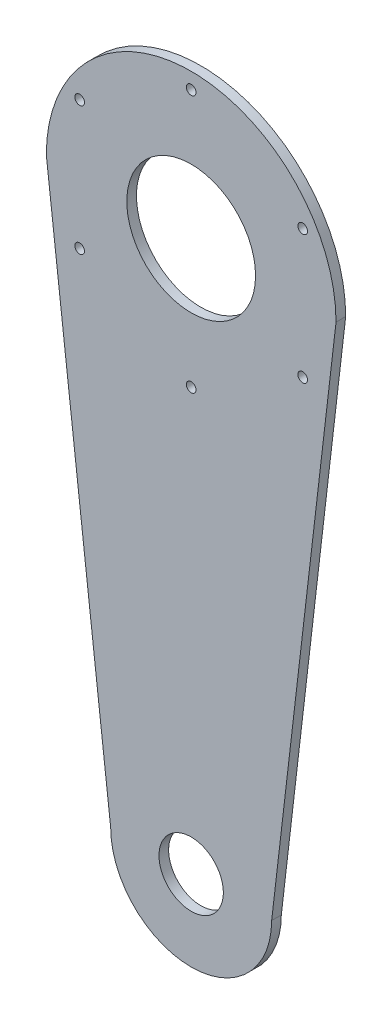
ISO-10303-21;
HEADER;
FILE_DESCRIPTION(('STEP AP214'),'2;1');
FILE_NAME('part.step','',(''),(''),'','','');
FILE_SCHEMA(('AUTOMOTIVE_DESIGN { 1 0 10303 214 1 1 1 1 }'));
ENDSEC;
DATA;
#1=APPLICATION_CONTEXT('core data for automotive mechanical design processes');
#2=APPLICATION_PROTOCOL_DEFINITION('international standard','automotive_design',2000,#1);
#3=PRODUCT_CONTEXT('',#1,'mechanical');
#4=PRODUCT('Part','Part','',(#3));
#5=PRODUCT_RELATED_PRODUCT_CATEGORY('part','',(#4));
#6=PRODUCT_DEFINITION_FORMATION('','',#4);
#7=PRODUCT_DEFINITION_CONTEXT('part definition',#1,'design');
#8=PRODUCT_DEFINITION('design','',#6,#7);
#9=PRODUCT_DEFINITION_SHAPE('','',#8);
#10=(LENGTH_UNIT() NAMED_UNIT(*) SI_UNIT(.MILLI.,.METRE.));
#11=(NAMED_UNIT(*) PLANE_ANGLE_UNIT() SI_UNIT($,.RADIAN.));
#12=(NAMED_UNIT(*) SI_UNIT($,.STERADIAN.) SOLID_ANGLE_UNIT());
#13=UNCERTAINTY_MEASURE_WITH_UNIT(LENGTH_MEASURE(1.E-05),#10,'distance_accuracy_value','');
#14=(GEOMETRIC_REPRESENTATION_CONTEXT(3) GLOBAL_UNCERTAINTY_ASSIGNED_CONTEXT((#13)) GLOBAL_UNIT_ASSIGNED_CONTEXT((#10,
#11,#12)) REPRESENTATION_CONTEXT('',''));
#15=CARTESIAN_POINT('',(0.,0.,0.));
#16=DIRECTION('',(0.,0.,1.));
#17=DIRECTION('',(1.,0.,0.));
#18=AXIS2_PLACEMENT_3D('',#15,#16,#17);
#19=CARTESIAN_POINT('',(-44.3927330386964,-5.19213251914581,3.));
#20=DIRECTION('',(0.993229670639021,0.116167212940237,0.));
#21=DIRECTION('',(-0.116167212940237,0.993229670639021,0.));
#22=AXIS2_PLACEMENT_3D('',#19,#20,#21);
#23=PLANE('',#22);
#24=DIRECTION('',(0.116167212940237,-0.993229670639021,0.));
#25=VECTOR('',#24,1.);
#26=CARTESIAN_POINT('',(-44.3927330386964,-5.19213251914581,0.));
#27=LINE('',#26,#25);
#28=CARTESIAN_POINT('',(-45.,0.,0.));
#29=VERTEX_POINT('',#28);
#30=CARTESIAN_POINT('',(-24.9999999999999,-171.,0.));
#31=VERTEX_POINT('',#30);
#32=EDGE_CURVE('E147',#29,#31,#27,.T.);
#33=ORIENTED_EDGE('',*,*,#32,.T.);
#34=DIRECTION('',(0.,0.,-1.));
#35=VECTOR('',#34,1.);
#36=CARTESIAN_POINT('',(-24.9999999999999,-171.,3.));
#37=LINE('',#36,#35);
#38=CARTESIAN_POINT('',(-24.9999999999999,-171.,3.));
#39=VERTEX_POINT('',#38);
#40=EDGE_CURVE('E11',#39,#31,#37,.T.);
#41=ORIENTED_EDGE('',*,*,#40,.F.);
#42=DIRECTION('',(0.116167212940237,-0.993229670639021,0.));
#43=VECTOR('',#42,1.);
#44=CARTESIAN_POINT('',(-44.3927330386964,-5.19213251914581,3.));
#45=LINE('',#44,#43);
#46=CARTESIAN_POINT('',(-45.,0.,3.));
#47=VERTEX_POINT('',#46);
#48=EDGE_CURVE('E96',#47,#39,#45,.T.);
#49=ORIENTED_EDGE('',*,*,#48,.F.);
#50=DIRECTION('',(0.,0.,-1.));
#51=VECTOR('',#50,1.);
#52=CARTESIAN_POINT('',(-45.,0.,3.));
#53=LINE('',#52,#51);
#54=EDGE_CURVE('E111',#47,#29,#53,.T.);
#55=ORIENTED_EDGE('',*,*,#54,.T.);
#56=EDGE_LOOP('',(#33,#41,#49,#55));
#57=FACE_BOUND('',#56,.T.);
#58=ADVANCED_FACE('F47',(#57),#23,.F.);
#59=CARTESIAN_POINT('',(1.12177646801898E-13,-171.,3.));
#60=DIRECTION('',(0.,0.,-1.));
#61=DIRECTION('',(-1.,0.,0.));
#62=AXIS2_PLACEMENT_3D('',#59,#60,#61);
#63=CYLINDRICAL_SURFACE('',#62,25.);
#64=CARTESIAN_POINT('',(1.12177646801898E-13,-171.,0.));
#65=DIRECTION('',(0.,0.,1.));
#66=DIRECTION('',(1.,0.,0.));
#67=AXIS2_PLACEMENT_3D('',#64,#65,#66);
#68=CIRCLE('',#67,25.);
#69=CARTESIAN_POINT('',(25.0000000000001,-171.,0.));
#70=VERTEX_POINT('',#69);
#71=EDGE_CURVE('E102',#31,#70,#68,.T.);
#72=ORIENTED_EDGE('',*,*,#71,.T.);
#73=DIRECTION('',(0.,0.,-1.));
#74=VECTOR('',#73,1.);
#75=CARTESIAN_POINT('',(25.0000000000001,-171.,3.));
#76=LINE('',#75,#74);
#77=CARTESIAN_POINT('',(25.0000000000001,-171.,3.));
#78=VERTEX_POINT('',#77);
#79=EDGE_CURVE('E57',#78,#70,#76,.T.);
#80=ORIENTED_EDGE('',*,*,#79,.F.);
#81=CARTESIAN_POINT('',(1.12177646801898E-13,-171.,3.));
#82=DIRECTION('',(0.,0.,1.));
#83=DIRECTION('',(1.,0.,0.));
#84=AXIS2_PLACEMENT_3D('',#81,#82,#83);
#85=CIRCLE('',#84,25.);
#86=EDGE_CURVE('E91',#39,#78,#85,.T.);
#87=ORIENTED_EDGE('',*,*,#86,.F.);
#88=ORIENTED_EDGE('',*,*,#40,.T.);
#89=EDGE_LOOP('',(#72,#80,#87,#88));
#90=FACE_BOUND('',#89,.T.);
#91=ADVANCED_FACE('F101',(#90),#63,.T.);
#92=CARTESIAN_POINT('',(44.3927330386964,-5.19213251914575,3.));
#93=DIRECTION('',(0.993229670639021,-0.116167212940236,0.));
#94=DIRECTION('',(0.116167212940236,0.993229670639021,0.));
#95=AXIS2_PLACEMENT_3D('',#92,#93,#94);
#96=PLANE('',#95);
#97=DIRECTION('',(-0.116167212940236,-0.993229670639021,0.));
#98=VECTOR('',#97,1.);
#99=CARTESIAN_POINT('',(44.3927330386964,-5.19213251914575,0.));
#100=LINE('',#99,#98);
#101=CARTESIAN_POINT('',(45.,0.,0.));
#102=VERTEX_POINT('',#101);
#103=EDGE_CURVE('E153',#102,#70,#100,.T.);
#104=ORIENTED_EDGE('',*,*,#103,.F.);
#105=DIRECTION('',(0.,0.,-1.));
#106=VECTOR('',#105,1.);
#107=CARTESIAN_POINT('',(45.,0.,3.));
#108=LINE('',#107,#106);
#109=CARTESIAN_POINT('',(45.,0.,3.));
#110=VERTEX_POINT('',#109);
#111=EDGE_CURVE('E81',#110,#102,#108,.T.);
#112=ORIENTED_EDGE('',*,*,#111,.F.);
#113=DIRECTION('',(-0.116167212940236,-0.993229670639021,0.));
#114=VECTOR('',#113,1.);
#115=CARTESIAN_POINT('',(44.3927330386964,-5.19213251914575,3.));
#116=LINE('',#115,#114);
#117=EDGE_CURVE('E94',#110,#78,#116,.T.);
#118=ORIENTED_EDGE('',*,*,#117,.T.);
#119=ORIENTED_EDGE('',*,*,#79,.T.);
#120=EDGE_LOOP('',(#104,#112,#118,#119));
#121=FACE_BOUND('',#120,.T.);
#122=ADVANCED_FACE('F107',(#121),#96,.T.);
#123=CARTESIAN_POINT('',(1.12177646801898E-13,-171.,3.));
#124=DIRECTION('',(0.,0.,-1.));
#125=DIRECTION('',(-1.,0.,0.));
#126=AXIS2_PLACEMENT_3D('',#123,#124,#125);
#127=CYLINDRICAL_SURFACE('',#126,10.);
#128=CARTESIAN_POINT('',(1.12177646801898E-13,-171.,3.));
#129=DIRECTION('',(0.,0.,1.));
#130=DIRECTION('',(1.,0.,0.));
#131=AXIS2_PLACEMENT_3D('',#128,#129,#130);
#132=CIRCLE('',#131,10.);
#133=CARTESIAN_POINT('',(10.0000000000001,-171.,3.));
#134=VERTEX_POINT('',#133);
#135=EDGE_CURVE('E265',#134,#134,#132,.T.);
#136=ORIENTED_EDGE('',*,*,#135,.T.);
#137=EDGE_LOOP('',(#136));
#138=FACE_BOUND('',#137,.T.);
#139=CARTESIAN_POINT('',(1.12177646801898E-13,-171.,0.));
#140=DIRECTION('',(0.,0.,1.));
#141=DIRECTION('',(1.,0.,0.));
#142=AXIS2_PLACEMENT_3D('',#139,#140,#141);
#143=CIRCLE('',#142,10.);
#144=CARTESIAN_POINT('',(10.0000000000001,-171.,0.));
#145=VERTEX_POINT('',#144);
#146=EDGE_CURVE('E143',#145,#145,#143,.T.);
#147=ORIENTED_EDGE('',*,*,#146,.F.);
#148=EDGE_LOOP('',(#147));
#149=FACE_BOUND('',#148,.T.);
#150=ADVANCED_FACE('F185',(#138,#149),#127,.F.);
#151=CARTESIAN_POINT('',(0.,0.,3.));
#152=DIRECTION('',(0.,0.,-1.));
#153=DIRECTION('',(-1.,0.,0.));
#154=AXIS2_PLACEMENT_3D('',#151,#152,#153);
#155=CYLINDRICAL_SURFACE('',#154,20.);
#156=CARTESIAN_POINT('',(0.,0.,3.));
#157=DIRECTION('',(0.,0.,1.));
#158=DIRECTION('',(1.,0.,0.));
#159=AXIS2_PLACEMENT_3D('',#156,#157,#158);
#160=CIRCLE('',#159,20.);
#161=CARTESIAN_POINT('',(20.,0.,3.));
#162=VERTEX_POINT('',#161);
#163=EDGE_CURVE('E261',#162,#162,#160,.T.);
#164=ORIENTED_EDGE('',*,*,#163,.T.);
#165=EDGE_LOOP('',(#164));
#166=FACE_BOUND('',#165,.T.);
#167=CARTESIAN_POINT('',(0.,0.,0.));
#168=DIRECTION('',(0.,0.,1.));
#169=DIRECTION('',(1.,0.,0.));
#170=AXIS2_PLACEMENT_3D('',#167,#168,#169);
#171=CIRCLE('',#170,20.);
#172=CARTESIAN_POINT('',(20.,0.,0.));
#173=VERTEX_POINT('',#172);
#174=EDGE_CURVE('E139',#173,#173,#171,.T.);
#175=ORIENTED_EDGE('',*,*,#174,.F.);
#176=EDGE_LOOP('',(#175));
#177=FACE_BOUND('',#176,.T.);
#178=ADVANCED_FACE('F188',(#166,#177),#155,.F.);
#179=CARTESIAN_POINT('',(0.,40.,3.));
#180=DIRECTION('',(0.,0.,-1.));
#181=DIRECTION('',(-1.,0.,0.));
#182=AXIS2_PLACEMENT_3D('',#179,#180,#181);
#183=CYLINDRICAL_SURFACE('',#182,1.5);
#184=CARTESIAN_POINT('',(0.,40.,3.));
#185=DIRECTION('',(0.,0.,1.));
#186=DIRECTION('',(1.,0.,0.));
#187=AXIS2_PLACEMENT_3D('',#184,#185,#186);
#188=CIRCLE('',#187,1.5);
#189=CARTESIAN_POINT('',(1.5,40.,3.));
#190=VERTEX_POINT('',#189);
#191=EDGE_CURVE('E257',#190,#190,#188,.T.);
#192=ORIENTED_EDGE('',*,*,#191,.T.);
#193=EDGE_LOOP('',(#192));
#194=FACE_BOUND('',#193,.T.);
#195=CARTESIAN_POINT('',(0.,40.,0.));
#196=DIRECTION('',(0.,0.,1.));
#197=DIRECTION('',(1.,0.,0.));
#198=AXIS2_PLACEMENT_3D('',#195,#196,#197);
#199=CIRCLE('',#198,1.5);
#200=CARTESIAN_POINT('',(1.5,40.,0.));
#201=VERTEX_POINT('',#200);
#202=EDGE_CURVE('E135',#201,#201,#199,.T.);
#203=ORIENTED_EDGE('',*,*,#202,.F.);
#204=EDGE_LOOP('',(#203));
#205=FACE_BOUND('',#204,.T.);
#206=ADVANCED_FACE('F192',(#194,#205),#183,.F.);
#207=CARTESIAN_POINT('',(34.6410161513776,19.9999999999999,3.));
#208=DIRECTION('',(0.,0.,-1.));
#209=DIRECTION('',(-1.,0.,0.));
#210=AXIS2_PLACEMENT_3D('',#207,#208,#209);
#211=CYLINDRICAL_SURFACE('',#210,1.5);
#212=CARTESIAN_POINT('',(34.6410161513776,19.9999999999999,3.));
#213=DIRECTION('',(0.,0.,1.));
#214=DIRECTION('',(1.,0.,0.));
#215=AXIS2_PLACEMENT_3D('',#212,#213,#214);
#216=CIRCLE('',#215,1.5);
#217=CARTESIAN_POINT('',(36.1410161513776,19.9999999999999,3.));
#218=VERTEX_POINT('',#217);
#219=EDGE_CURVE('E253',#218,#218,#216,.T.);
#220=ORIENTED_EDGE('',*,*,#219,.T.);
#221=EDGE_LOOP('',(#220));
#222=FACE_BOUND('',#221,.T.);
#223=CARTESIAN_POINT('',(34.6410161513776,19.9999999999999,0.));
#224=DIRECTION('',(0.,0.,1.));
#225=DIRECTION('',(1.,0.,0.));
#226=AXIS2_PLACEMENT_3D('',#223,#224,#225);
#227=CIRCLE('',#226,1.5);
#228=CARTESIAN_POINT('',(36.1410161513776,19.9999999999999,0.));
#229=VERTEX_POINT('',#228);
#230=EDGE_CURVE('E131',#229,#229,#227,.T.);
#231=ORIENTED_EDGE('',*,*,#230,.F.);
#232=EDGE_LOOP('',(#231));
#233=FACE_BOUND('',#232,.T.);
#234=ADVANCED_FACE('F196',(#222,#233),#211,.F.);
#235=CARTESIAN_POINT('',(34.6410161513775,-20.0000000000002,3.));
#236=DIRECTION('',(0.,0.,-1.));
#237=DIRECTION('',(-1.,0.,0.));
#238=AXIS2_PLACEMENT_3D('',#235,#236,#237);
#239=CYLINDRICAL_SURFACE('',#238,1.5);
#240=CARTESIAN_POINT('',(34.6410161513775,-20.0000000000002,3.));
#241=DIRECTION('',(0.,0.,1.));
#242=DIRECTION('',(1.,0.,0.));
#243=AXIS2_PLACEMENT_3D('',#240,#241,#242);
#244=CIRCLE('',#243,1.5);
#245=CARTESIAN_POINT('',(36.1410161513775,-20.0000000000002,3.));
#246=VERTEX_POINT('',#245);
#247=EDGE_CURVE('E245',#246,#246,#244,.T.);
#248=ORIENTED_EDGE('',*,*,#247,.T.);
#249=EDGE_LOOP('',(#248));
#250=FACE_BOUND('',#249,.T.);
#251=CARTESIAN_POINT('',(34.6410161513775,-20.0000000000002,0.));
#252=DIRECTION('',(0.,0.,1.));
#253=DIRECTION('',(1.,0.,0.));
#254=AXIS2_PLACEMENT_3D('',#251,#252,#253);
#255=CIRCLE('',#254,1.5);
#256=CARTESIAN_POINT('',(36.1410161513775,-20.0000000000002,0.));
#257=VERTEX_POINT('',#256);
#258=EDGE_CURVE('E127',#257,#257,#255,.T.);
#259=ORIENTED_EDGE('',*,*,#258,.F.);
#260=EDGE_LOOP('',(#259));
#261=FACE_BOUND('',#260,.T.);
#262=ADVANCED_FACE('F200',(#250,#261),#239,.F.);
#263=CARTESIAN_POINT('',(-2.79318507107451E-13,-40.,3.));
#264=DIRECTION('',(0.,0.,-1.));
#265=DIRECTION('',(-1.,0.,0.));
#266=AXIS2_PLACEMENT_3D('',#263,#264,#265);
#267=CYLINDRICAL_SURFACE('',#266,1.5);
#268=CARTESIAN_POINT('',(-2.79318507107451E-13,-40.,3.));
#269=DIRECTION('',(0.,0.,1.));
#270=DIRECTION('',(1.,0.,0.));
#271=AXIS2_PLACEMENT_3D('',#268,#269,#270);
#272=CIRCLE('',#271,1.5);
#273=CARTESIAN_POINT('',(1.49999999999972,-40.,3.));
#274=VERTEX_POINT('',#273);
#275=EDGE_CURVE('E240',#274,#274,#272,.T.);
#276=ORIENTED_EDGE('',*,*,#275,.T.);
#277=EDGE_LOOP('',(#276));
#278=FACE_BOUND('',#277,.T.);
#279=CARTESIAN_POINT('',(-2.79318507107451E-13,-40.,0.));
#280=DIRECTION('',(0.,0.,1.));
#281=DIRECTION('',(1.,0.,0.));
#282=AXIS2_PLACEMENT_3D('',#279,#280,#281);
#283=CIRCLE('',#282,1.5);
#284=CARTESIAN_POINT('',(1.49999999999972,-40.,0.));
#285=VERTEX_POINT('',#284);
#286=EDGE_CURVE('E123',#285,#285,#283,.T.);
#287=ORIENTED_EDGE('',*,*,#286,.F.);
#288=EDGE_LOOP('',(#287));
#289=FACE_BOUND('',#288,.T.);
#290=ADVANCED_FACE('F204',(#278,#289),#267,.F.);
#291=CARTESIAN_POINT('',(-34.6410161513777,-19.9999999999997,3.));
#292=DIRECTION('',(0.,0.,-1.));
#293=DIRECTION('',(-1.,0.,0.));
#294=AXIS2_PLACEMENT_3D('',#291,#292,#293);
#295=CYLINDRICAL_SURFACE('',#294,1.5);
#296=CARTESIAN_POINT('',(-34.6410161513777,-19.9999999999997,3.));
#297=DIRECTION('',(0.,0.,1.));
#298=DIRECTION('',(1.,0.,0.));
#299=AXIS2_PLACEMENT_3D('',#296,#297,#298);
#300=CIRCLE('',#299,1.5);
#301=CARTESIAN_POINT('',(-33.1410161513777,-19.9999999999997,3.));
#302=VERTEX_POINT('',#301);
#303=EDGE_CURVE('E218',#302,#302,#300,.T.);
#304=ORIENTED_EDGE('',*,*,#303,.T.);
#305=EDGE_LOOP('',(#304));
#306=FACE_BOUND('',#305,.T.);
#307=CARTESIAN_POINT('',(-34.6410161513777,-19.9999999999997,0.));
#308=DIRECTION('',(0.,0.,1.));
#309=DIRECTION('',(1.,0.,0.));
#310=AXIS2_PLACEMENT_3D('',#307,#308,#309);
#311=CIRCLE('',#310,1.5);
#312=CARTESIAN_POINT('',(-33.1410161513777,-19.9999999999997,0.));
#313=VERTEX_POINT('',#312);
#314=EDGE_CURVE('E119',#313,#313,#311,.T.);
#315=ORIENTED_EDGE('',*,*,#314,.F.);
#316=EDGE_LOOP('',(#315));
#317=FACE_BOUND('',#316,.T.);
#318=ADVANCED_FACE('F207',(#306,#317),#295,.F.);
#319=CARTESIAN_POINT('',(-34.6410161513773,20.0000000000004,3.));
#320=DIRECTION('',(0.,0.,-1.));
#321=DIRECTION('',(-1.,0.,0.));
#322=AXIS2_PLACEMENT_3D('',#319,#320,#321);
#323=CYLINDRICAL_SURFACE('',#322,1.5);
#324=CARTESIAN_POINT('',(-34.6410161513773,20.0000000000004,3.));
#325=DIRECTION('',(0.,0.,1.));
#326=DIRECTION('',(1.,0.,0.));
#327=AXIS2_PLACEMENT_3D('',#324,#325,#326);
#328=CIRCLE('',#327,1.5);
#329=CARTESIAN_POINT('',(-33.1410161513773,20.0000000000004,3.));
#330=VERTEX_POINT('',#329);
#331=EDGE_CURVE('E158',#330,#330,#328,.T.);
#332=ORIENTED_EDGE('',*,*,#331,.T.);
#333=EDGE_LOOP('',(#332));
#334=FACE_BOUND('',#333,.T.);
#335=CARTESIAN_POINT('',(-34.6410161513773,20.0000000000004,0.));
#336=DIRECTION('',(0.,0.,1.));
#337=DIRECTION('',(1.,0.,0.));
#338=AXIS2_PLACEMENT_3D('',#335,#336,#337);
#339=CIRCLE('',#338,1.5);
#340=CARTESIAN_POINT('',(-33.1410161513773,20.0000000000004,0.));
#341=VERTEX_POINT('',#340);
#342=EDGE_CURVE('E115',#341,#341,#339,.T.);
#343=ORIENTED_EDGE('',*,*,#342,.F.);
#344=EDGE_LOOP('',(#343));
#345=FACE_BOUND('',#344,.T.);
#346=ADVANCED_FACE('F49',(#334,#345),#323,.F.);
#347=CARTESIAN_POINT('',(0.,0.,3.));
#348=DIRECTION('',(0.,0.,-1.));
#349=DIRECTION('',(-1.,0.,0.));
#350=AXIS2_PLACEMENT_3D('',#347,#348,#349);
#351=CYLINDRICAL_SURFACE('',#350,45.);
#352=CARTESIAN_POINT('',(0.,0.,0.));
#353=DIRECTION('',(0.,0.,1.));
#354=DIRECTION('',(1.,0.,0.));
#355=AXIS2_PLACEMENT_3D('',#352,#353,#354);
#356=CIRCLE('',#355,45.);
#357=EDGE_CURVE('E84',#102,#29,#356,.T.);
#358=ORIENTED_EDGE('',*,*,#357,.T.);
#359=ORIENTED_EDGE('',*,*,#54,.F.);
#360=CARTESIAN_POINT('',(0.,0.,3.));
#361=DIRECTION('',(0.,0.,1.));
#362=DIRECTION('',(1.,0.,0.));
#363=AXIS2_PLACEMENT_3D('',#360,#361,#362);
#364=CIRCLE('',#363,45.);
#365=EDGE_CURVE('E65',#110,#47,#364,.T.);
#366=ORIENTED_EDGE('',*,*,#365,.F.);
#367=ORIENTED_EDGE('',*,*,#111,.T.);
#368=EDGE_LOOP('',(#358,#359,#366,#367));
#369=FACE_BOUND('',#368,.T.);
#370=ADVANCED_FACE('F172',(#369),#351,.T.);
#371=CARTESIAN_POINT('',(0.,0.,3.));
#372=DIRECTION('',(0.,0.,1.));
#373=DIRECTION('',(1.,0.,0.));
#374=AXIS2_PLACEMENT_3D('',#371,#372,#373);
#375=PLANE('',#374);
#376=ORIENTED_EDGE('',*,*,#331,.F.);
#377=EDGE_LOOP('',(#376));
#378=FACE_BOUND('',#377,.T.);
#379=ORIENTED_EDGE('',*,*,#303,.F.);
#380=EDGE_LOOP('',(#379));
#381=FACE_BOUND('',#380,.T.);
#382=ORIENTED_EDGE('',*,*,#275,.F.);
#383=EDGE_LOOP('',(#382));
#384=FACE_BOUND('',#383,.T.);
#385=ORIENTED_EDGE('',*,*,#247,.F.);
#386=EDGE_LOOP('',(#385));
#387=FACE_BOUND('',#386,.T.);
#388=ORIENTED_EDGE('',*,*,#219,.F.);
#389=EDGE_LOOP('',(#388));
#390=FACE_BOUND('',#389,.T.);
#391=ORIENTED_EDGE('',*,*,#191,.F.);
#392=EDGE_LOOP('',(#391));
#393=FACE_BOUND('',#392,.T.);
#394=ORIENTED_EDGE('',*,*,#163,.F.);
#395=EDGE_LOOP('',(#394));
#396=FACE_BOUND('',#395,.T.);
#397=ORIENTED_EDGE('',*,*,#135,.F.);
#398=EDGE_LOOP('',(#397));
#399=FACE_BOUND('',#398,.T.);
#400=ORIENTED_EDGE('',*,*,#48,.T.);
#401=ORIENTED_EDGE('',*,*,#86,.T.);
#402=ORIENTED_EDGE('',*,*,#117,.F.);
#403=ORIENTED_EDGE('',*,*,#365,.T.);
#404=EDGE_LOOP('',(#400,#401,#402,#403));
#405=FACE_BOUND('',#404,.T.);
#406=ADVANCED_FACE('F92',(#378,#381,#384,#387,#390,#393,#396,#399,#405),#375,.T.);
#407=CARTESIAN_POINT('',(0.,0.,0.));
#408=DIRECTION('',(0.,0.,1.));
#409=DIRECTION('',(1.,0.,0.));
#410=AXIS2_PLACEMENT_3D('',#407,#408,#409);
#411=PLANE('',#410);
#412=ORIENTED_EDGE('',*,*,#342,.T.);
#413=EDGE_LOOP('',(#412));
#414=FACE_BOUND('',#413,.T.);
#415=ORIENTED_EDGE('',*,*,#314,.T.);
#416=EDGE_LOOP('',(#415));
#417=FACE_BOUND('',#416,.T.);
#418=ORIENTED_EDGE('',*,*,#286,.T.);
#419=EDGE_LOOP('',(#418));
#420=FACE_BOUND('',#419,.T.);
#421=ORIENTED_EDGE('',*,*,#258,.T.);
#422=EDGE_LOOP('',(#421));
#423=FACE_BOUND('',#422,.T.);
#424=ORIENTED_EDGE('',*,*,#230,.T.);
#425=EDGE_LOOP('',(#424));
#426=FACE_BOUND('',#425,.T.);
#427=ORIENTED_EDGE('',*,*,#202,.T.);
#428=EDGE_LOOP('',(#427));
#429=FACE_BOUND('',#428,.T.);
#430=ORIENTED_EDGE('',*,*,#174,.T.);
#431=EDGE_LOOP('',(#430));
#432=FACE_BOUND('',#431,.T.);
#433=ORIENTED_EDGE('',*,*,#146,.T.);
#434=EDGE_LOOP('',(#433));
#435=FACE_BOUND('',#434,.T.);
#436=ORIENTED_EDGE('',*,*,#32,.F.);
#437=ORIENTED_EDGE('',*,*,#357,.F.);
#438=ORIENTED_EDGE('',*,*,#103,.T.);
#439=ORIENTED_EDGE('',*,*,#71,.F.);
#440=EDGE_LOOP('',(#436,#437,#438,#439));
#441=FACE_BOUND('',#440,.T.);
#442=ADVANCED_FACE('F165',(#414,#417,#420,#423,#426,#429,#432,#435,#441),#411,.F.);
#443=CLOSED_SHELL('',(#58,#91,#122,#150,#178,#206,#234,#262,#290,#318,#346,#370,#406,#442));
#444=MANIFOLD_SOLID_BREP('B2',#443);
#445=ADVANCED_BREP_SHAPE_REPRESENTATION('',(#18,#444),#14);
#446=SHAPE_DEFINITION_REPRESENTATION(#9,#445);
ENDSEC;
END-ISO-10303-21;
